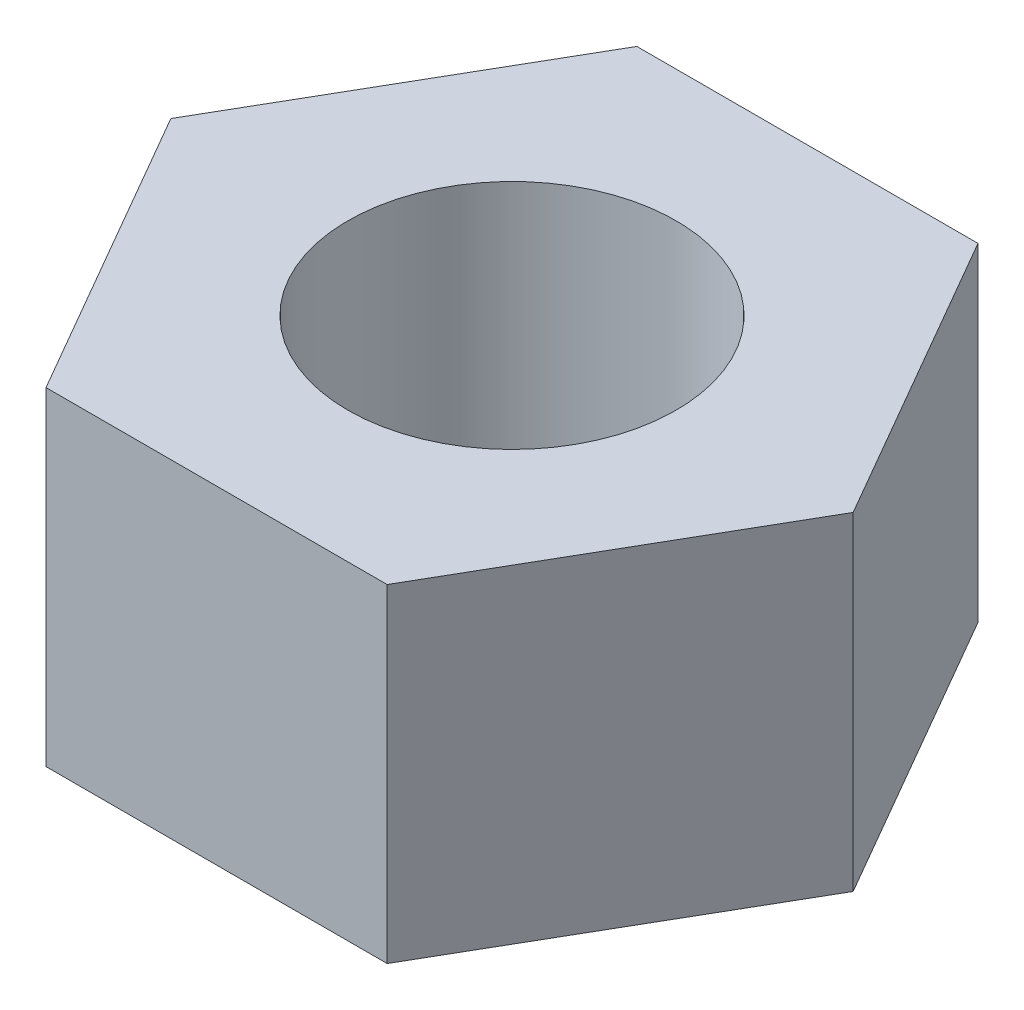
ISO-10303-21;
HEADER;
FILE_DESCRIPTION(('STEP AP214'),'2;1');
FILE_NAME('part.step','',(''),(''),'','','');
FILE_SCHEMA(('AUTOMOTIVE_DESIGN { 1 0 10303 214 1 1 1 1 }'));
ENDSEC;
DATA;
#1=APPLICATION_CONTEXT('core data for automotive mechanical design processes');
#2=APPLICATION_PROTOCOL_DEFINITION('international standard','automotive_design',2000,#1);
#3=PRODUCT_CONTEXT('',#1,'mechanical');
#4=PRODUCT('Part','Part','',(#3));
#5=PRODUCT_RELATED_PRODUCT_CATEGORY('part','',(#4));
#6=PRODUCT_DEFINITION_FORMATION('','',#4);
#7=PRODUCT_DEFINITION_CONTEXT('part definition',#1,'design');
#8=PRODUCT_DEFINITION('design','',#6,#7);
#9=PRODUCT_DEFINITION_SHAPE('','',#8);
#10=(LENGTH_UNIT() NAMED_UNIT(*) SI_UNIT(.MILLI.,.METRE.));
#11=(NAMED_UNIT(*) PLANE_ANGLE_UNIT() SI_UNIT($,.RADIAN.));
#12=(NAMED_UNIT(*) SI_UNIT($,.STERADIAN.) SOLID_ANGLE_UNIT());
#13=UNCERTAINTY_MEASURE_WITH_UNIT(LENGTH_MEASURE(1.E-05),#10,'distance_accuracy_value','');
#14=(GEOMETRIC_REPRESENTATION_CONTEXT(3) GLOBAL_UNCERTAINTY_ASSIGNED_CONTEXT((#13)) GLOBAL_UNIT_ASSIGNED_CONTEXT((#10,
#11,#12)) REPRESENTATION_CONTEXT('',''));
#15=CARTESIAN_POINT('',(0.,0.,0.));
#16=DIRECTION('',(0.,0.,1.));
#17=DIRECTION('',(1.,0.,0.));
#18=AXIS2_PLACEMENT_3D('',#15,#16,#17);
#19=CARTESIAN_POINT('',(0.,5.,0.));
#20=DIRECTION('',(0.,1.,0.));
#21=DIRECTION('',(0.,0.,1.));
#22=AXIS2_PLACEMENT_3D('',#19,#20,#21);
#23=PLANE('',#22);
#24=DIRECTION('',(-0.5,0.,-0.866025403784439));
#25=VECTOR('',#24,1.);
#26=CARTESIAN_POINT('',(10.3923048454133,5.,0.));
#27=LINE('',#26,#25);
#28=CARTESIAN_POINT('',(10.3923048454133,5.,0.));
#29=VERTEX_POINT('',#28);
#30=CARTESIAN_POINT('',(5.19615242270663,5.,-9.));
#31=VERTEX_POINT('',#30);
#32=EDGE_CURVE('E129',#29,#31,#27,.T.);
#33=ORIENTED_EDGE('',*,*,#32,.T.);
#34=DIRECTION('',(-1.,0.,0.));
#35=VECTOR('',#34,1.);
#36=CARTESIAN_POINT('',(5.19615242270663,5.,-9.));
#37=LINE('',#36,#35);
#38=CARTESIAN_POINT('',(-5.19615242270663,5.,-9.));
#39=VERTEX_POINT('',#38);
#40=EDGE_CURVE('E87',#31,#39,#37,.T.);
#41=ORIENTED_EDGE('',*,*,#40,.T.);
#42=DIRECTION('',(-0.5,0.,0.866025403784439));
#43=VECTOR('',#42,1.);
#44=CARTESIAN_POINT('',(-5.19615242270663,5.,-9.));
#45=LINE('',#44,#43);
#46=CARTESIAN_POINT('',(-10.3923048454133,5.,0.));
#47=VERTEX_POINT('',#46);
#48=EDGE_CURVE('E100',#39,#47,#45,.T.);
#49=ORIENTED_EDGE('',*,*,#48,.T.);
#50=DIRECTION('',(0.5,0.,0.866025403784439));
#51=VECTOR('',#50,1.);
#52=CARTESIAN_POINT('',(-10.3923048454133,5.,0.));
#53=LINE('',#52,#51);
#54=CARTESIAN_POINT('',(-5.19615242270663,5.,9.));
#55=VERTEX_POINT('',#54);
#56=EDGE_CURVE('E94',#47,#55,#53,.T.);
#57=ORIENTED_EDGE('',*,*,#56,.T.);
#58=DIRECTION('',(1.,0.,0.));
#59=VECTOR('',#58,1.);
#60=CARTESIAN_POINT('',(-5.19615242270663,5.,9.));
#61=LINE('',#60,#59);
#62=CARTESIAN_POINT('',(5.19615242270663,5.,9.));
#63=VERTEX_POINT('',#62);
#64=EDGE_CURVE('E98',#55,#63,#61,.T.);
#65=ORIENTED_EDGE('',*,*,#64,.T.);
#66=DIRECTION('',(0.5,0.,-0.866025403784438));
#67=VECTOR('',#66,1.);
#68=CARTESIAN_POINT('',(5.19615242270663,5.,9.));
#69=LINE('',#68,#67);
#70=EDGE_CURVE('E50',#63,#29,#69,.T.);
#71=ORIENTED_EDGE('',*,*,#70,.T.);
#72=EDGE_LOOP('',(#33,#41,#49,#57,#65,#71));
#73=FACE_BOUND('',#72,.T.);
#74=CARTESIAN_POINT('',(0.,5.,0.));
#75=DIRECTION('',(0.,1.,0.));
#76=DIRECTION('',(0.,0.,1.));
#77=AXIS2_PLACEMENT_3D('',#74,#75,#76);
#78=CIRCLE('',#77,5.);
#79=CARTESIAN_POINT('',(0.,5.,5.));
#80=VERTEX_POINT('',#79);
#81=EDGE_CURVE('E122',#80,#80,#78,.T.);
#82=ORIENTED_EDGE('',*,*,#81,.F.);
#83=EDGE_LOOP('',(#82));
#84=FACE_BOUND('',#83,.T.);
#85=ADVANCED_FACE('F33',(#73,#84),#23,.T.);
#86=CARTESIAN_POINT('',(0.,-5.,0.));
#87=DIRECTION('',(0.,1.,0.));
#88=DIRECTION('',(0.,0.,1.));
#89=AXIS2_PLACEMENT_3D('',#86,#87,#88);
#90=PLANE('',#89);
#91=DIRECTION('',(-0.5,0.,-0.866025403784439));
#92=VECTOR('',#91,1.);
#93=CARTESIAN_POINT('',(10.3923048454133,-5.,0.));
#94=LINE('',#93,#92);
#95=CARTESIAN_POINT('',(10.3923048454133,-5.,0.));
#96=VERTEX_POINT('',#95);
#97=CARTESIAN_POINT('',(5.19615242270663,-5.,-9.));
#98=VERTEX_POINT('',#97);
#99=EDGE_CURVE('E118',#96,#98,#94,.T.);
#100=ORIENTED_EDGE('',*,*,#99,.F.);
#101=DIRECTION('',(0.5,0.,-0.866025403784438));
#102=VECTOR('',#101,1.);
#103=CARTESIAN_POINT('',(5.19615242270663,-5.,9.));
#104=LINE('',#103,#102);
#105=CARTESIAN_POINT('',(5.19615242270663,-5.,9.));
#106=VERTEX_POINT('',#105);
#107=EDGE_CURVE('E79',#106,#96,#104,.T.);
#108=ORIENTED_EDGE('',*,*,#107,.F.);
#109=DIRECTION('',(1.,0.,0.));
#110=VECTOR('',#109,1.);
#111=CARTESIAN_POINT('',(-5.19615242270663,-5.,9.));
#112=LINE('',#111,#110);
#113=CARTESIAN_POINT('',(-5.19615242270663,-5.,9.));
#114=VERTEX_POINT('',#113);
#115=EDGE_CURVE('E73',#114,#106,#112,.T.);
#116=ORIENTED_EDGE('',*,*,#115,.F.);
#117=DIRECTION('',(0.5,0.,0.866025403784439));
#118=VECTOR('',#117,1.);
#119=CARTESIAN_POINT('',(-10.3923048454133,-5.,0.));
#120=LINE('',#119,#118);
#121=CARTESIAN_POINT('',(-10.3923048454133,-5.,0.));
#122=VERTEX_POINT('',#121);
#123=EDGE_CURVE('E108',#122,#114,#120,.T.);
#124=ORIENTED_EDGE('',*,*,#123,.F.);
#125=DIRECTION('',(-0.5,0.,0.866025403784439));
#126=VECTOR('',#125,1.);
#127=CARTESIAN_POINT('',(-5.19615242270663,-5.,-9.));
#128=LINE('',#127,#126);
#129=CARTESIAN_POINT('',(-5.19615242270663,-5.,-9.));
#130=VERTEX_POINT('',#129);
#131=EDGE_CURVE('E124',#130,#122,#128,.T.);
#132=ORIENTED_EDGE('',*,*,#131,.F.);
#133=DIRECTION('',(-1.,0.,0.));
#134=VECTOR('',#133,1.);
#135=CARTESIAN_POINT('',(5.19615242270663,-5.,-9.));
#136=LINE('',#135,#134);
#137=EDGE_CURVE('E121',#98,#130,#136,.T.);
#138=ORIENTED_EDGE('',*,*,#137,.F.);
#139=EDGE_LOOP('',(#100,#108,#116,#124,#132,#138));
#140=FACE_BOUND('',#139,.T.);
#141=CARTESIAN_POINT('',(0.,-5.,0.));
#142=DIRECTION('',(0.,1.,0.));
#143=DIRECTION('',(0.,0.,1.));
#144=AXIS2_PLACEMENT_3D('',#141,#142,#143);
#145=CIRCLE('',#144,5.);
#146=CARTESIAN_POINT('',(0.,-5.,5.));
#147=VERTEX_POINT('',#146);
#148=EDGE_CURVE('E222',#147,#147,#145,.T.);
#149=ORIENTED_EDGE('',*,*,#148,.T.);
#150=EDGE_LOOP('',(#149));
#151=FACE_BOUND('',#150,.T.);
#152=ADVANCED_FACE('F138',(#140,#151),#90,.F.);
#153=CARTESIAN_POINT('',(10.3923048454133,5.,0.));
#154=DIRECTION('',(-0.866025403784438,0.,0.5));
#155=DIRECTION('',(0.5,0.,0.866025403784439));
#156=AXIS2_PLACEMENT_3D('',#153,#154,#155);
#157=PLANE('',#156);
#158=ORIENTED_EDGE('',*,*,#99,.T.);
#159=DIRECTION('',(0.,-1.,0.));
#160=VECTOR('',#159,1.);
#161=CARTESIAN_POINT('',(5.19615242270663,5.,-9.));
#162=LINE('',#161,#160);
#163=EDGE_CURVE('E11',#31,#98,#162,.T.);
#164=ORIENTED_EDGE('',*,*,#163,.F.);
#165=ORIENTED_EDGE('',*,*,#32,.F.);
#166=DIRECTION('',(0.,-1.,0.));
#167=VECTOR('',#166,1.);
#168=CARTESIAN_POINT('',(10.3923048454133,5.,0.));
#169=LINE('',#168,#167);
#170=EDGE_CURVE('E114',#29,#96,#169,.T.);
#171=ORIENTED_EDGE('',*,*,#170,.T.);
#172=EDGE_LOOP('',(#158,#164,#165,#171));
#173=FACE_BOUND('',#172,.T.);
#174=ADVANCED_FACE('F35',(#173),#157,.F.);
#175=CARTESIAN_POINT('',(5.19615242270663,5.,-9.));
#176=DIRECTION('',(0.,0.,1.));
#177=DIRECTION('',(1.,0.,0.));
#178=AXIS2_PLACEMENT_3D('',#175,#176,#177);
#179=PLANE('',#178);
#180=ORIENTED_EDGE('',*,*,#137,.T.);
#181=DIRECTION('',(0.,-1.,0.));
#182=VECTOR('',#181,1.);
#183=CARTESIAN_POINT('',(-5.19615242270663,5.,-9.));
#184=LINE('',#183,#182);
#185=EDGE_CURVE('E42',#39,#130,#184,.T.);
#186=ORIENTED_EDGE('',*,*,#185,.F.);
#187=ORIENTED_EDGE('',*,*,#40,.F.);
#188=ORIENTED_EDGE('',*,*,#163,.T.);
#189=EDGE_LOOP('',(#180,#186,#187,#188));
#190=FACE_BOUND('',#189,.T.);
#191=ADVANCED_FACE('F163',(#190),#179,.F.);
#192=CARTESIAN_POINT('',(-5.19615242270663,5.,-9.));
#193=DIRECTION('',(0.866025403784439,0.,0.5));
#194=DIRECTION('',(0.5,0.,-0.866025403784439));
#195=AXIS2_PLACEMENT_3D('',#192,#193,#194);
#196=PLANE('',#195);
#197=ORIENTED_EDGE('',*,*,#131,.T.);
#198=DIRECTION('',(0.,-1.,0.));
#199=VECTOR('',#198,1.);
#200=CARTESIAN_POINT('',(-10.3923048454133,5.,0.));
#201=LINE('',#200,#199);
#202=EDGE_CURVE('E109',#47,#122,#201,.T.);
#203=ORIENTED_EDGE('',*,*,#202,.F.);
#204=ORIENTED_EDGE('',*,*,#48,.F.);
#205=ORIENTED_EDGE('',*,*,#185,.T.);
#206=EDGE_LOOP('',(#197,#203,#204,#205));
#207=FACE_BOUND('',#206,.T.);
#208=ADVANCED_FACE('F135',(#207),#196,.F.);
#209=CARTESIAN_POINT('',(-10.3923048454133,5.,0.));
#210=DIRECTION('',(0.866025403784439,0.,-0.5));
#211=DIRECTION('',(-0.5,0.,-0.866025403784439));
#212=AXIS2_PLACEMENT_3D('',#209,#210,#211);
#213=PLANE('',#212);
#214=ORIENTED_EDGE('',*,*,#123,.T.);
#215=DIRECTION('',(0.,-1.,0.));
#216=VECTOR('',#215,1.);
#217=CARTESIAN_POINT('',(-5.19615242270663,5.,9.));
#218=LINE('',#217,#216);
#219=EDGE_CURVE('E105',#55,#114,#218,.T.);
#220=ORIENTED_EDGE('',*,*,#219,.F.);
#221=ORIENTED_EDGE('',*,*,#56,.F.);
#222=ORIENTED_EDGE('',*,*,#202,.T.);
#223=EDGE_LOOP('',(#214,#220,#221,#222));
#224=FACE_BOUND('',#223,.T.);
#225=ADVANCED_FACE('F106',(#224),#213,.F.);
#226=CARTESIAN_POINT('',(-5.19615242270663,5.,9.));
#227=DIRECTION('',(0.,0.,-1.));
#228=DIRECTION('',(-1.,0.,0.));
#229=AXIS2_PLACEMENT_3D('',#226,#227,#228);
#230=PLANE('',#229);
#231=ORIENTED_EDGE('',*,*,#115,.T.);
#232=DIRECTION('',(0.,-1.,0.));
#233=VECTOR('',#232,1.);
#234=CARTESIAN_POINT('',(5.19615242270663,5.,9.));
#235=LINE('',#234,#233);
#236=EDGE_CURVE('E110',#63,#106,#235,.T.);
#237=ORIENTED_EDGE('',*,*,#236,.F.);
#238=ORIENTED_EDGE('',*,*,#64,.F.);
#239=ORIENTED_EDGE('',*,*,#219,.T.);
#240=EDGE_LOOP('',(#231,#237,#238,#239));
#241=FACE_BOUND('',#240,.T.);
#242=ADVANCED_FACE('F112',(#241),#230,.F.);
#243=CARTESIAN_POINT('',(5.19615242270663,5.,9.));
#244=DIRECTION('',(-0.866025403784438,0.,-0.5));
#245=DIRECTION('',(-0.5,0.,0.866025403784439));
#246=AXIS2_PLACEMENT_3D('',#243,#244,#245);
#247=PLANE('',#246);
#248=ORIENTED_EDGE('',*,*,#107,.T.);
#249=ORIENTED_EDGE('',*,*,#170,.F.);
#250=ORIENTED_EDGE('',*,*,#70,.F.);
#251=ORIENTED_EDGE('',*,*,#236,.T.);
#252=EDGE_LOOP('',(#248,#249,#250,#251));
#253=FACE_BOUND('',#252,.T.);
#254=ADVANCED_FACE('F143',(#253),#247,.F.);
#255=CARTESIAN_POINT('',(0.,5.,0.));
#256=DIRECTION('',(0.,-1.,0.));
#257=DIRECTION('',(0.,0.,-1.));
#258=AXIS2_PLACEMENT_3D('',#255,#256,#257);
#259=CYLINDRICAL_SURFACE('',#258,5.);
#260=ORIENTED_EDGE('',*,*,#81,.T.);
#261=EDGE_LOOP('',(#260));
#262=FACE_BOUND('',#261,.T.);
#263=ORIENTED_EDGE('',*,*,#148,.F.);
#264=EDGE_LOOP('',(#263));
#265=FACE_BOUND('',#264,.T.);
#266=ADVANCED_FACE('F145',(#262,#265),#259,.F.);
#267=CLOSED_SHELL('',(#85,#152,#174,#191,#208,#225,#242,#254,#266));
#268=MANIFOLD_SOLID_BREP('B2',#267);
#269=ADVANCED_BREP_SHAPE_REPRESENTATION('',(#18,#268),#14);
#270=SHAPE_DEFINITION_REPRESENTATION(#9,#269);
ENDSEC;
END-ISO-10303-21;
